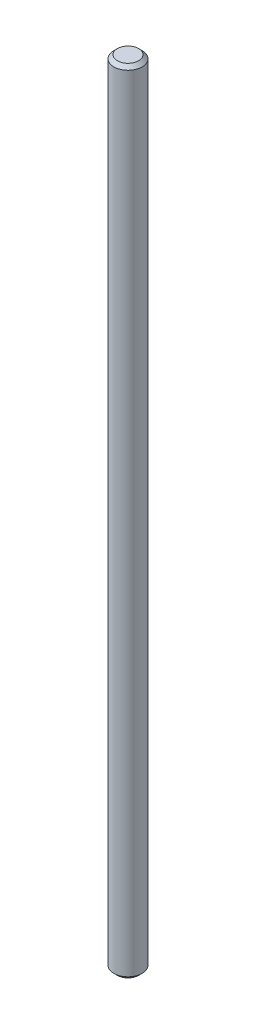
ISO-10303-21;
HEADER;
FILE_DESCRIPTION(('STEP AP214'),'2;1');
FILE_NAME('part.step','',(''),(''),'','','');
FILE_SCHEMA(('AUTOMOTIVE_DESIGN { 1 0 10303 214 1 1 1 1 }'));
ENDSEC;
DATA;
#1=APPLICATION_CONTEXT('core data for automotive mechanical design processes');
#2=APPLICATION_PROTOCOL_DEFINITION('international standard','automotive_design',2000,#1);
#3=PRODUCT_CONTEXT('',#1,'mechanical');
#4=PRODUCT('Part','Part','',(#3));
#5=PRODUCT_RELATED_PRODUCT_CATEGORY('part','',(#4));
#6=PRODUCT_DEFINITION_FORMATION('','',#4);
#7=PRODUCT_DEFINITION_CONTEXT('part definition',#1,'design');
#8=PRODUCT_DEFINITION('design','',#6,#7);
#9=PRODUCT_DEFINITION_SHAPE('','',#8);
#10=(LENGTH_UNIT() NAMED_UNIT(*) SI_UNIT(.MILLI.,.METRE.));
#11=(NAMED_UNIT(*) PLANE_ANGLE_UNIT() SI_UNIT($,.RADIAN.));
#12=(NAMED_UNIT(*) SI_UNIT($,.STERADIAN.) SOLID_ANGLE_UNIT());
#13=UNCERTAINTY_MEASURE_WITH_UNIT(LENGTH_MEASURE(1.E-05),#10,'distance_accuracy_value','');
#14=(GEOMETRIC_REPRESENTATION_CONTEXT(3) GLOBAL_UNCERTAINTY_ASSIGNED_CONTEXT((#13)) GLOBAL_UNIT_ASSIGNED_CONTEXT((#10,
#11,#12)) REPRESENTATION_CONTEXT('',''));
#15=CARTESIAN_POINT('',(0.,0.,0.));
#16=DIRECTION('',(0.,0.,1.));
#17=DIRECTION('',(1.,0.,0.));
#18=AXIS2_PLACEMENT_3D('',#15,#16,#17);
#19=CARTESIAN_POINT('',(0.,0.,0.));
#20=DIRECTION('',(0.,1.,0.));
#21=DIRECTION('',(0.,0.,1.));
#22=AXIS2_PLACEMENT_3D('',#19,#20,#21);
#23=CYLINDRICAL_SURFACE('',#22,4.);
#24=CARTESIAN_POINT('',(0.,1.,0.));
#25=DIRECTION('',(0.,-1.,0.));
#26=DIRECTION('',(0.,0.,-1.));
#27=AXIS2_PLACEMENT_3D('',#24,#25,#26);
#28=CIRCLE('',#27,4.);
#29=CARTESIAN_POINT('',(0.,1.,-4.));
#30=VERTEX_POINT('',#29);
#31=EDGE_CURVE('E51',#30,#30,#28,.F.);
#32=ORIENTED_EDGE('',*,*,#31,.T.);
#33=EDGE_LOOP('',(#32));
#34=FACE_BOUND('',#33,.T.);
#35=CARTESIAN_POINT('',(0.,223.,0.));
#36=DIRECTION('',(0.,-1.,0.));
#37=DIRECTION('',(0.,0.,-1.));
#38=AXIS2_PLACEMENT_3D('',#35,#36,#37);
#39=CIRCLE('',#38,4.);
#40=CARTESIAN_POINT('',(0.,223.,-4.));
#41=VERTEX_POINT('',#40);
#42=EDGE_CURVE('E55',#41,#41,#39,.T.);
#43=ORIENTED_EDGE('',*,*,#42,.T.);
#44=EDGE_LOOP('',(#43));
#45=FACE_BOUND('',#44,.T.);
#46=ADVANCED_FACE('F39',(#34,#45),#23,.T.);
#47=CARTESIAN_POINT('',(0.,0.,0.));
#48=DIRECTION('',(0.,-1.,0.));
#49=DIRECTION('',(0.,0.,-1.));
#50=AXIS2_PLACEMENT_3D('',#47,#48,#49);
#51=PLANE('',#50);
#52=CARTESIAN_POINT('',(0.,0.,0.));
#53=DIRECTION('',(0.,-1.,0.));
#54=DIRECTION('',(0.,0.,-1.));
#55=AXIS2_PLACEMENT_3D('',#52,#53,#54);
#56=CIRCLE('',#55,3.);
#57=CARTESIAN_POINT('',(0.,0.,-3.));
#58=VERTEX_POINT('',#57);
#59=EDGE_CURVE('E47',#58,#58,#56,.T.);
#60=ORIENTED_EDGE('',*,*,#59,.T.);
#61=EDGE_LOOP('',(#60));
#62=FACE_BOUND('',#61,.T.);
#63=ADVANCED_FACE('F71',(#62),#51,.T.);
#64=CARTESIAN_POINT('',(0.,224.,0.));
#65=DIRECTION('',(0.,-1.,0.));
#66=DIRECTION('',(0.,0.,-1.));
#67=AXIS2_PLACEMENT_3D('',#64,#65,#66);
#68=PLANE('',#67);
#69=CARTESIAN_POINT('',(0.,224.,0.));
#70=DIRECTION('',(0.,-1.,0.));
#71=DIRECTION('',(0.,0.,-1.));
#72=AXIS2_PLACEMENT_3D('',#69,#70,#71);
#73=CIRCLE('',#72,3.);
#74=CARTESIAN_POINT('',(0.,224.,-3.));
#75=VERTEX_POINT('',#74);
#76=EDGE_CURVE('E10',#75,#75,#73,.F.);
#77=ORIENTED_EDGE('',*,*,#76,.T.);
#78=EDGE_LOOP('',(#77));
#79=FACE_BOUND('',#78,.T.);
#80=ADVANCED_FACE('F68',(#79),#68,.F.);
#81=CARTESIAN_POINT('',(0.,1.,0.));
#82=DIRECTION('',(0.,1.,0.));
#83=DIRECTION('',(0.,0.,1.));
#84=AXIS2_PLACEMENT_3D('',#81,#82,#83);
#85=CONICAL_SURFACE('',#84,4.,0.785398163397445);
#86=ORIENTED_EDGE('',*,*,#59,.F.);
#87=EDGE_LOOP('',(#86));
#88=FACE_BOUND('',#87,.T.);
#89=ORIENTED_EDGE('',*,*,#31,.F.);
#90=EDGE_LOOP('',(#89));
#91=FACE_BOUND('',#90,.T.);
#92=ADVANCED_FACE('F64',(#88,#91),#85,.T.);
#93=CARTESIAN_POINT('',(0.,224.,0.));
#94=DIRECTION('',(0.,-1.,0.));
#95=DIRECTION('',(0.,0.,-1.));
#96=AXIS2_PLACEMENT_3D('',#93,#94,#95);
#97=CONICAL_SURFACE('',#96,3.,0.785398163397447);
#98=ORIENTED_EDGE('',*,*,#42,.F.);
#99=EDGE_LOOP('',(#98));
#100=FACE_BOUND('',#99,.T.);
#101=ORIENTED_EDGE('',*,*,#76,.F.);
#102=EDGE_LOOP('',(#101));
#103=FACE_BOUND('',#102,.T.);
#104=ADVANCED_FACE('F42',(#100,#103),#97,.T.);
#105=CLOSED_SHELL('',(#46,#63,#80,#92,#104));
#106=MANIFOLD_SOLID_BREP('B2',#105);
#107=ADVANCED_BREP_SHAPE_REPRESENTATION('',(#18,#106),#14);
#108=SHAPE_DEFINITION_REPRESENTATION(#9,#107);
ENDSEC;
END-ISO-10303-21;
